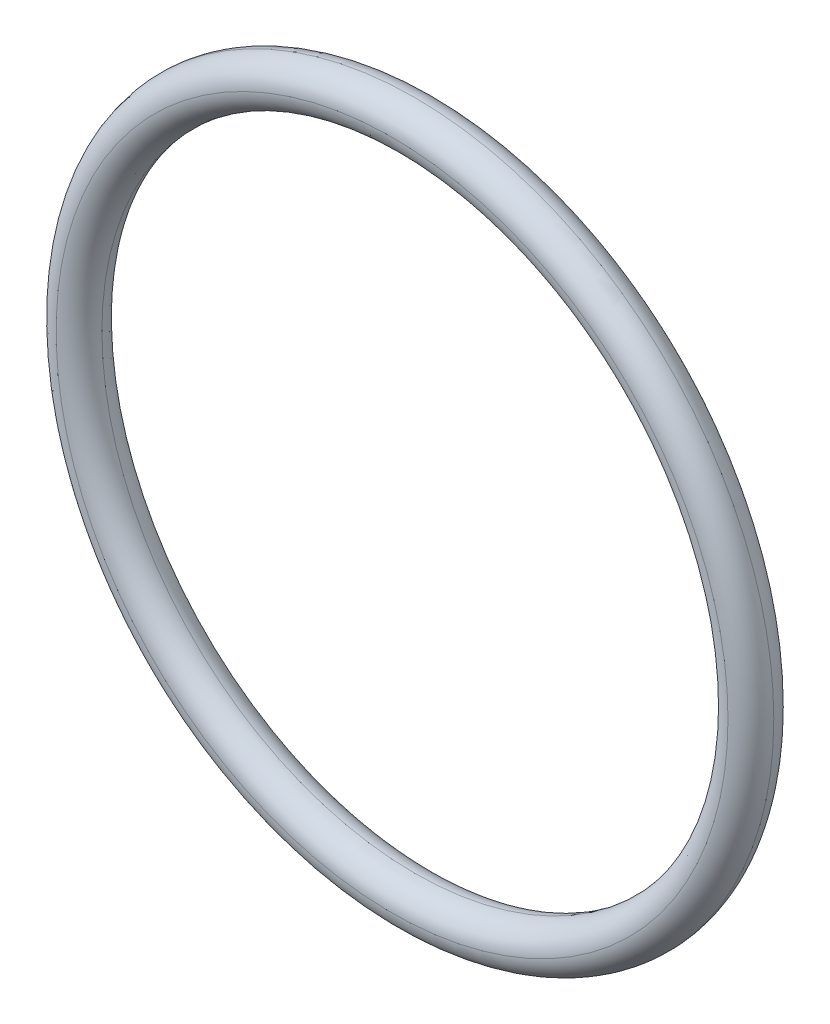
ISO-10303-21;
HEADER;
FILE_DESCRIPTION(('STEP AP214'),'2;1');
FILE_NAME('part.step','',(''),(''),'','','');
FILE_SCHEMA(('AUTOMOTIVE_DESIGN { 1 0 10303 214 1 1 1 1 }'));
ENDSEC;
DATA;
#1=APPLICATION_CONTEXT('core data for automotive mechanical design processes');
#2=APPLICATION_PROTOCOL_DEFINITION('international standard','automotive_design',2000,#1);
#3=PRODUCT_CONTEXT('',#1,'mechanical');
#4=PRODUCT('Part','Part','',(#3));
#5=PRODUCT_RELATED_PRODUCT_CATEGORY('part','',(#4));
#6=PRODUCT_DEFINITION_FORMATION('','',#4);
#7=PRODUCT_DEFINITION_CONTEXT('part definition',#1,'design');
#8=PRODUCT_DEFINITION('design','',#6,#7);
#9=PRODUCT_DEFINITION_SHAPE('','',#8);
#10=(LENGTH_UNIT() NAMED_UNIT(*) SI_UNIT(.MILLI.,.METRE.));
#11=(NAMED_UNIT(*) PLANE_ANGLE_UNIT() SI_UNIT($,.RADIAN.));
#12=(NAMED_UNIT(*) SI_UNIT($,.STERADIAN.) SOLID_ANGLE_UNIT());
#13=UNCERTAINTY_MEASURE_WITH_UNIT(LENGTH_MEASURE(1.E-05),#10,'distance_accuracy_value','');
#14=(GEOMETRIC_REPRESENTATION_CONTEXT(3) GLOBAL_UNCERTAINTY_ASSIGNED_CONTEXT((#13)) GLOBAL_UNIT_ASSIGNED_CONTEXT((#10,
#11,#12)) REPRESENTATION_CONTEXT('',''));
#15=CARTESIAN_POINT('',(0.,0.,0.));
#16=DIRECTION('',(0.,0.,1.));
#17=DIRECTION('',(1.,0.,0.));
#18=AXIS2_PLACEMENT_3D('',#15,#16,#17);
#19=CARTESIAN_POINT('',(0.,0.,-0.501650000000001));
#20=DIRECTION('',(0.,0.,-1.));
#21=DIRECTION('',(0.,1.,0.));
#22=AXIS2_PLACEMENT_3D('',#19,#20,#21);
#23=TOROIDAL_SURFACE('',#22,7.35965,0.50165);
#24=CARTESIAN_POINT('',(0.,0.,-1.0033));
#25=DIRECTION('',(0.,0.,-1.));
#26=DIRECTION('',(0.,1.,0.));
#27=AXIS2_PLACEMENT_3D('',#24,#25,#26);
#28=CIRCLE('',#27,7.35965);
#29=CARTESIAN_POINT('',(0.,7.35965,-1.0033));
#30=VERTEX_POINT('',#29);
#31=EDGE_CURVE('E10',#30,#30,#28,.F.);
#32=ORIENTED_EDGE('',*,*,#31,.F.);
#33=EDGE_LOOP('',(#32));
#34=FACE_BOUND('',#33,.T.);
#35=CARTESIAN_POINT('',(0.,0.,-0.501650000000001));
#36=DIRECTION('',(0.,0.,-1.));
#37=DIRECTION('',(0.,1.,0.));
#38=AXIS2_PLACEMENT_3D('',#35,#36,#37);
#39=CIRCLE('',#38,6.858);
#40=CARTESIAN_POINT('',(0.,6.858,-0.50165));
#41=VERTEX_POINT('',#40);
#42=EDGE_CURVE('E44',#41,#41,#39,.T.);
#43=ORIENTED_EDGE('',*,*,#42,.F.);
#44=EDGE_LOOP('',(#43));
#45=FACE_BOUND('',#44,.T.);
#46=ADVANCED_FACE('F40',(#34,#45),#23,.T.);
#47=CARTESIAN_POINT('',(0.,0.,-0.50165));
#48=DIRECTION('',(0.,0.,1.));
#49=DIRECTION('',(1.,0.,0.));
#50=AXIS2_PLACEMENT_3D('',#47,#48,#49);
#51=TOROIDAL_SURFACE('',#50,7.35965,0.50165);
#52=ORIENTED_EDGE('',*,*,#42,.T.);
#53=EDGE_LOOP('',(#52));
#54=FACE_BOUND('',#53,.T.);
#55=CARTESIAN_POINT('',(0.,0.,0.));
#56=DIRECTION('',(0.,0.,1.));
#57=DIRECTION('',(1.,0.,0.));
#58=AXIS2_PLACEMENT_3D('',#55,#56,#57);
#59=CIRCLE('',#58,7.35965);
#60=CARTESIAN_POINT('',(7.35965,0.,0.));
#61=VERTEX_POINT('',#60);
#62=EDGE_CURVE('E57',#61,#61,#59,.F.);
#63=ORIENTED_EDGE('',*,*,#62,.F.);
#64=EDGE_LOOP('',(#63));
#65=FACE_BOUND('',#64,.T.);
#66=ADVANCED_FACE('F68',(#54,#65),#51,.T.);
#67=CARTESIAN_POINT('',(0.,0.,-0.50165));
#68=DIRECTION('',(0.,0.,1.));
#69=DIRECTION('',(1.,0.,0.));
#70=AXIS2_PLACEMENT_3D('',#67,#68,#69);
#71=TOROIDAL_SURFACE('',#70,7.35965,0.50165);
#72=CARTESIAN_POINT('',(0.,0.,-0.50165));
#73=DIRECTION('',(0.,0.,1.));
#74=DIRECTION('',(1.,0.,0.));
#75=AXIS2_PLACEMENT_3D('',#72,#73,#74);
#76=CIRCLE('',#75,7.8613);
#77=CARTESIAN_POINT('',(7.8613,0.,-0.50165));
#78=VERTEX_POINT('',#77);
#79=EDGE_CURVE('E49',#78,#78,#76,.F.);
#80=ORIENTED_EDGE('',*,*,#79,.F.);
#81=EDGE_LOOP('',(#80));
#82=FACE_BOUND('',#81,.T.);
#83=ORIENTED_EDGE('',*,*,#62,.T.);
#84=EDGE_LOOP('',(#83));
#85=FACE_BOUND('',#84,.T.);
#86=ADVANCED_FACE('F76',(#82,#85),#71,.T.);
#87=CARTESIAN_POINT('',(0.,0.,-0.501650000000001));
#88=DIRECTION('',(0.,0.,-1.));
#89=DIRECTION('',(0.,1.,0.));
#90=AXIS2_PLACEMENT_3D('',#87,#88,#89);
#91=TOROIDAL_SURFACE('',#90,7.35965,0.50165);
#92=ORIENTED_EDGE('',*,*,#31,.T.);
#93=EDGE_LOOP('',(#92));
#94=FACE_BOUND('',#93,.T.);
#95=ORIENTED_EDGE('',*,*,#79,.T.);
#96=EDGE_LOOP('',(#95));
#97=FACE_BOUND('',#96,.T.);
#98=ADVANCED_FACE('F42',(#94,#97),#91,.T.);
#99=CLOSED_SHELL('',(#46,#66,#86,#98));
#100=MANIFOLD_SOLID_BREP('B2',#99);
#101=ADVANCED_BREP_SHAPE_REPRESENTATION('',(#18,#100),#14);
#102=SHAPE_DEFINITION_REPRESENTATION(#9,#101);
ENDSEC;
END-ISO-10303-21;
